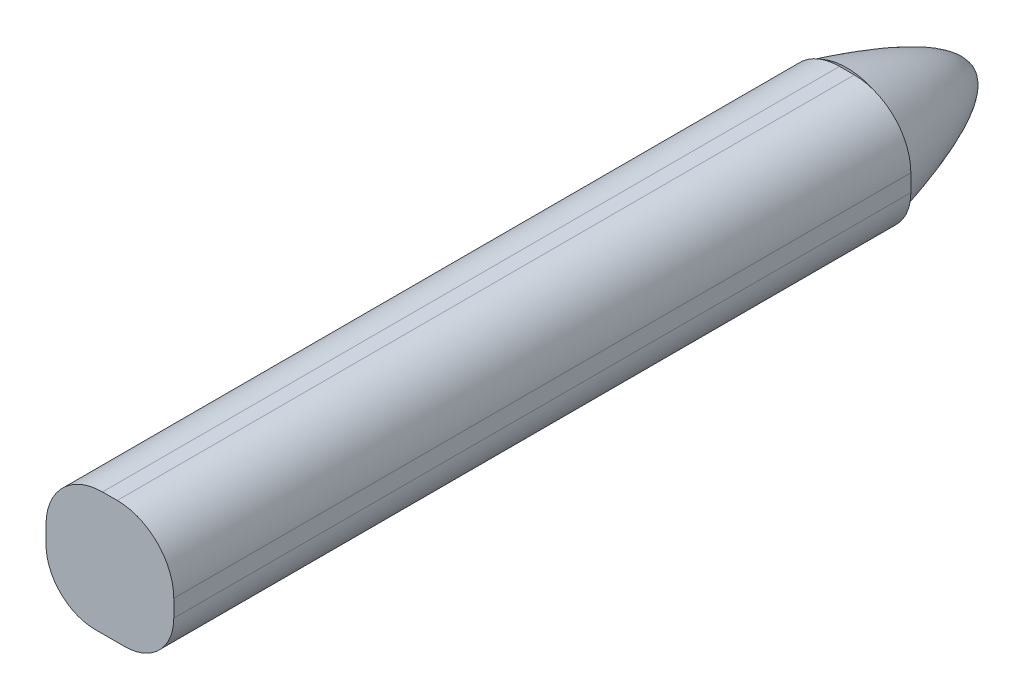
ISO-10303-21;
HEADER;
FILE_DESCRIPTION(('STEP AP214'),'2;1');
FILE_NAME('part.step','',(''),(''),'','','');
FILE_SCHEMA(('AUTOMOTIVE_DESIGN { 1 0 10303 214 1 1 1 1 }'));
ENDSEC;
DATA;
#1=APPLICATION_CONTEXT('core data for automotive mechanical design processes');
#2=APPLICATION_PROTOCOL_DEFINITION('international standard','automotive_design',2000,#1);
#3=PRODUCT_CONTEXT('',#1,'mechanical');
#4=PRODUCT('Part','Part','',(#3));
#5=PRODUCT_RELATED_PRODUCT_CATEGORY('part','',(#4));
#6=PRODUCT_DEFINITION_FORMATION('','',#4);
#7=PRODUCT_DEFINITION_CONTEXT('part definition',#1,'design');
#8=PRODUCT_DEFINITION('design','',#6,#7);
#9=PRODUCT_DEFINITION_SHAPE('','',#8);
#10=(LENGTH_UNIT() NAMED_UNIT(*) SI_UNIT(.MILLI.,.METRE.));
#11=(NAMED_UNIT(*) PLANE_ANGLE_UNIT() SI_UNIT($,.RADIAN.));
#12=(NAMED_UNIT(*) SI_UNIT($,.STERADIAN.) SOLID_ANGLE_UNIT());
#13=UNCERTAINTY_MEASURE_WITH_UNIT(LENGTH_MEASURE(1.E-05),#10,'distance_accuracy_value','');
#14=(GEOMETRIC_REPRESENTATION_CONTEXT(3) GLOBAL_UNCERTAINTY_ASSIGNED_CONTEXT((#13)) GLOBAL_UNIT_ASSIGNED_CONTEXT((#10,
#11,#12)) REPRESENTATION_CONTEXT('',''));
#15=CARTESIAN_POINT('',(0.,0.,0.));
#16=DIRECTION('',(0.,0.,1.));
#17=DIRECTION('',(1.,0.,0.));
#18=AXIS2_PLACEMENT_3D('',#15,#16,#17);
#19=CARTESIAN_POINT('',(300.,-250.,-7500.));
#20=DIRECTION('',(0.,0.,-1.));
#21=DIRECTION('',(-1.,0.,0.));
#22=AXIS2_PLACEMENT_3D('',#19,#20,#21);
#23=PLANE('',#22);
#24=CARTESIAN_POINT('',(300.,-250.,-7500.));
#25=DIRECTION('',(0.,0.,1.));
#26=DIRECTION('',(-1.,0.,0.));
#27=AXIS2_PLACEMENT_3D('',#24,#25,#26);
#28=CIRCLE('',#27,1000.);
#29=CARTESIAN_POINT('',(364.220206694953,-1247.93575196606,-7500.));
#30=VERTEX_POINT('',#29);
#31=CARTESIAN_POINT('',(1300.,-249.999999999993,-7500.));
#32=VERTEX_POINT('',#31);
#33=EDGE_CURVE('E135',#30,#32,#28,.T.);
#34=ORIENTED_EDGE('',*,*,#33,.F.);
#35=CARTESIAN_POINT('',(0.,0.,-7500.));
#36=DIRECTION('',(0.,0.,1.));
#37=DIRECTION('',(1.,0.,0.));
#38=AXIS2_PLACEMENT_3D('',#35,#36,#37);
#39=CIRCLE('',#38,1300.);
#40=CARTESIAN_POINT('',(1300.,0.,-7500.));
#41=VERTEX_POINT('',#40);
#42=EDGE_CURVE('E11',#30,#41,#39,.T.);
#43=ORIENTED_EDGE('',*,*,#42,.T.);
#44=DIRECTION('',(0.,1.,0.));
#45=VECTOR('',#44,1.);
#46=CARTESIAN_POINT('',(1300.,-249.999999999993,-7500.));
#47=LINE('',#46,#45);
#48=EDGE_CURVE('E136',#32,#41,#47,.T.);
#49=ORIENTED_EDGE('',*,*,#48,.F.);
#50=EDGE_LOOP('',(#34,#43,#49));
#51=FACE_BOUND('',#50,.T.);
#52=ADVANCED_FACE('F35',(#51),#23,.T.);
#53=CARTESIAN_POINT('',(1300.,99.9999999999919,-7500.));
#54=VERTEX_POINT('',#53);
#55=EDGE_CURVE('E134',#41,#54,#47,.T.);
#56=ORIENTED_EDGE('',*,*,#55,.F.);
#57=CARTESIAN_POINT('',(0.,0.,-7500.));
#58=DIRECTION('',(0.,0.,1.));
#59=DIRECTION('',(1.,0.,0.));
#60=AXIS2_PLACEMENT_3D('',#57,#58,#59);
#61=CIRCLE('',#60,1300.);
#62=CARTESIAN_POINT('',(547.175639296289,1179.23654105557,-7500.));
#63=VERTEX_POINT('',#62);
#64=EDGE_CURVE('E198',#41,#63,#61,.T.);
#65=ORIENTED_EDGE('',*,*,#64,.T.);
#66=CARTESIAN_POINT('',(150.,100.,-7500.));
#67=DIRECTION('',(0.,0.,1.));
#68=DIRECTION('',(-1.,0.,0.));
#69=AXIS2_PLACEMENT_3D('',#66,#67,#68);
#70=CIRCLE('',#69,1150.);
#71=EDGE_CURVE('E140',#54,#63,#70,.T.);
#72=ORIENTED_EDGE('',*,*,#71,.F.);
#73=EDGE_LOOP('',(#56,#65,#72));
#74=FACE_BOUND('',#73,.T.);
#75=ADVANCED_FACE('F245',(#74),#23,.T.);
#76=DIRECTION('',(0.,-1.,0.));
#77=VECTOR('',#76,1.);
#78=CARTESIAN_POINT('',(-1300.,-249.999999999993,-7500.));
#79=LINE('',#78,#77);
#80=CARTESIAN_POINT('',(-1300.,0.,-7500.));
#81=VERTEX_POINT('',#80);
#82=CARTESIAN_POINT('',(-1300.,-249.999999999993,-7500.));
#83=VERTEX_POINT('',#82);
#84=EDGE_CURVE('E81',#81,#83,#79,.T.);
#85=ORIENTED_EDGE('',*,*,#84,.F.);
#86=CARTESIAN_POINT('',(-364.220206694953,-1247.93575196606,-7500.));
#87=VERTEX_POINT('',#86);
#88=EDGE_CURVE('E44',#81,#87,#39,.T.);
#89=ORIENTED_EDGE('',*,*,#88,.T.);
#90=CARTESIAN_POINT('',(-300.,-250.,-7500.));
#91=DIRECTION('',(0.,0.,1.));
#92=DIRECTION('',(-1.,0.,0.));
#93=AXIS2_PLACEMENT_3D('',#90,#91,#92);
#94=CIRCLE('',#93,1000.);
#95=EDGE_CURVE('E153',#83,#87,#94,.T.);
#96=ORIENTED_EDGE('',*,*,#95,.F.);
#97=EDGE_LOOP('',(#85,#89,#96));
#98=FACE_BOUND('',#97,.T.);
#99=ADVANCED_FACE('F178',(#98),#23,.T.);
#100=CARTESIAN_POINT('',(300.,-250.,7500.));
#101=DIRECTION('',(0.,0.,-1.));
#102=DIRECTION('',(-1.,0.,0.));
#103=AXIS2_PLACEMENT_3D('',#100,#101,#102);
#104=CYLINDRICAL_SURFACE('',#103,1000.);
#105=CARTESIAN_POINT('',(299.999999999993,-1250.,-7500.));
#106=VERTEX_POINT('',#105);
#107=EDGE_CURVE('E131',#106,#30,#28,.T.);
#108=ORIENTED_EDGE('',*,*,#107,.T.);
#109=ORIENTED_EDGE('',*,*,#33,.T.);
#110=DIRECTION('',(0.,0.,-1.));
#111=VECTOR('',#110,1.);
#112=CARTESIAN_POINT('',(1300.,-249.999999999993,7500.));
#113=LINE('',#112,#111);
#114=CARTESIAN_POINT('',(1300.,-249.999999999993,7500.));
#115=VERTEX_POINT('',#114);
#116=EDGE_CURVE('E171',#115,#32,#113,.T.);
#117=ORIENTED_EDGE('',*,*,#116,.F.);
#118=CARTESIAN_POINT('',(300.,-250.,7500.));
#119=DIRECTION('',(0.,0.,1.));
#120=DIRECTION('',(-1.,0.,0.));
#121=AXIS2_PLACEMENT_3D('',#118,#119,#120);
#122=CIRCLE('',#121,1000.);
#123=CARTESIAN_POINT('',(299.999999999993,-1250.,7500.));
#124=VERTEX_POINT('',#123);
#125=EDGE_CURVE('E158',#124,#115,#122,.T.);
#126=ORIENTED_EDGE('',*,*,#125,.F.);
#127=DIRECTION('',(0.,0.,-1.));
#128=VECTOR('',#127,1.);
#129=CARTESIAN_POINT('',(299.999999999993,-1250.,7500.));
#130=LINE('',#129,#128);
#131=EDGE_CURVE('E127',#124,#106,#130,.T.);
#132=ORIENTED_EDGE('',*,*,#131,.T.);
#133=EDGE_LOOP('',(#108,#109,#117,#126,#132));
#134=FACE_BOUND('',#133,.T.);
#135=ADVANCED_FACE('F37',(#134),#104,.T.);
#136=CARTESIAN_POINT('',(1300.,-249.999999999993,7500.));
#137=DIRECTION('',(-1.,0.,0.));
#138=DIRECTION('',(0.,0.,1.));
#139=AXIS2_PLACEMENT_3D('',#136,#137,#138);
#140=PLANE('',#139);
#141=ORIENTED_EDGE('',*,*,#48,.T.);
#142=ORIENTED_EDGE('',*,*,#55,.T.);
#143=DIRECTION('',(0.,0.,-1.));
#144=VECTOR('',#143,1.);
#145=CARTESIAN_POINT('',(1300.,99.9999999999919,7500.));
#146=LINE('',#145,#144);
#147=CARTESIAN_POINT('',(1300.,99.9999999999919,7500.));
#148=VERTEX_POINT('',#147);
#149=EDGE_CURVE('E169',#148,#54,#146,.T.);
#150=ORIENTED_EDGE('',*,*,#149,.F.);
#151=DIRECTION('',(0.,1.,0.));
#152=VECTOR('',#151,1.);
#153=CARTESIAN_POINT('',(1300.,-249.999999999993,7500.));
#154=LINE('',#153,#152);
#155=EDGE_CURVE('E90',#115,#148,#154,.T.);
#156=ORIENTED_EDGE('',*,*,#155,.F.);
#157=ORIENTED_EDGE('',*,*,#116,.T.);
#158=EDGE_LOOP('',(#141,#142,#150,#156,#157));
#159=FACE_BOUND('',#158,.T.);
#160=ADVANCED_FACE('F263',(#159),#140,.F.);
#161=CARTESIAN_POINT('',(150.,100.,7500.));
#162=DIRECTION('',(0.,0.,-1.));
#163=DIRECTION('',(-1.,0.,0.));
#164=AXIS2_PLACEMENT_3D('',#161,#162,#163);
#165=CYLINDRICAL_SURFACE('',#164,1150.);
#166=ORIENTED_EDGE('',*,*,#71,.T.);
#167=CARTESIAN_POINT('',(149.999999999992,1250.,-7500.));
#168=VERTEX_POINT('',#167);
#169=EDGE_CURVE('E139',#63,#168,#70,.T.);
#170=ORIENTED_EDGE('',*,*,#169,.T.);
#171=DIRECTION('',(0.,0.,-1.));
#172=VECTOR('',#171,1.);
#173=CARTESIAN_POINT('',(149.999999999992,1250.,7500.));
#174=LINE('',#173,#172);
#175=CARTESIAN_POINT('',(149.999999999992,1250.,7500.));
#176=VERTEX_POINT('',#175);
#177=EDGE_CURVE('E166',#176,#168,#174,.T.);
#178=ORIENTED_EDGE('',*,*,#177,.F.);
#179=CARTESIAN_POINT('',(150.,100.,7500.));
#180=DIRECTION('',(0.,0.,1.));
#181=DIRECTION('',(-1.,0.,0.));
#182=AXIS2_PLACEMENT_3D('',#179,#180,#181);
#183=CIRCLE('',#182,1150.);
#184=EDGE_CURVE('E195',#148,#176,#183,.T.);
#185=ORIENTED_EDGE('',*,*,#184,.F.);
#186=ORIENTED_EDGE('',*,*,#149,.T.);
#187=EDGE_LOOP('',(#166,#170,#178,#185,#186));
#188=FACE_BOUND('',#187,.T.);
#189=ADVANCED_FACE('F267',(#188),#165,.T.);
#190=CARTESIAN_POINT('',(-149.999999999992,1250.,7500.));
#191=DIRECTION('',(0.,-1.,0.));
#192=DIRECTION('',(0.,0.,-1.));
#193=AXIS2_PLACEMENT_3D('',#190,#191,#192);
#194=PLANE('',#193);
#195=DIRECTION('',(-1.,0.,0.));
#196=VECTOR('',#195,1.);
#197=CARTESIAN_POINT('',(-149.999999999992,1250.,-7500.));
#198=LINE('',#197,#196);
#199=CARTESIAN_POINT('',(-149.999999999992,1250.,-7500.));
#200=VERTEX_POINT('',#199);
#201=EDGE_CURVE('E143',#168,#200,#198,.T.);
#202=ORIENTED_EDGE('',*,*,#201,.T.);
#203=DIRECTION('',(0.,0.,-1.));
#204=VECTOR('',#203,1.);
#205=CARTESIAN_POINT('',(-149.999999999992,1250.,7500.));
#206=LINE('',#205,#204);
#207=CARTESIAN_POINT('',(-149.999999999992,1250.,7500.));
#208=VERTEX_POINT('',#207);
#209=EDGE_CURVE('E163',#208,#200,#206,.T.);
#210=ORIENTED_EDGE('',*,*,#209,.F.);
#211=DIRECTION('',(-1.,0.,0.));
#212=VECTOR('',#211,1.);
#213=CARTESIAN_POINT('',(-149.999999999992,1250.,7500.));
#214=LINE('',#213,#212);
#215=EDGE_CURVE('E202',#176,#208,#214,.T.);
#216=ORIENTED_EDGE('',*,*,#215,.F.);
#217=ORIENTED_EDGE('',*,*,#177,.T.);
#218=EDGE_LOOP('',(#202,#210,#216,#217));
#219=FACE_BOUND('',#218,.T.);
#220=ADVANCED_FACE('F208',(#219),#194,.F.);
#221=CARTESIAN_POINT('',(-150.,100.,7500.));
#222=DIRECTION('',(0.,0.,-1.));
#223=DIRECTION('',(-1.,0.,0.));
#224=AXIS2_PLACEMENT_3D('',#221,#222,#223);
#225=CYLINDRICAL_SURFACE('',#224,1150.);
#226=CARTESIAN_POINT('',(-150.,100.,-7500.));
#227=DIRECTION('',(0.,0.,1.));
#228=DIRECTION('',(1.,0.,0.));
#229=AXIS2_PLACEMENT_3D('',#226,#227,#228);
#230=CIRCLE('',#229,1150.);
#231=CARTESIAN_POINT('',(-547.175639296289,1179.23654105557,-7500.));
#232=VERTEX_POINT('',#231);
#233=EDGE_CURVE('E147',#200,#232,#230,.T.);
#234=ORIENTED_EDGE('',*,*,#233,.T.);
#235=CARTESIAN_POINT('',(-1300.,99.9999999999921,-7500.));
#236=VERTEX_POINT('',#235);
#237=EDGE_CURVE('E146',#232,#236,#230,.T.);
#238=ORIENTED_EDGE('',*,*,#237,.T.);
#239=DIRECTION('',(0.,0.,-1.));
#240=VECTOR('',#239,1.);
#241=CARTESIAN_POINT('',(-1300.,99.9999999999921,7500.));
#242=LINE('',#241,#240);
#243=CARTESIAN_POINT('',(-1300.,99.9999999999921,7500.));
#244=VERTEX_POINT('',#243);
#245=EDGE_CURVE('E120',#244,#236,#242,.T.);
#246=ORIENTED_EDGE('',*,*,#245,.F.);
#247=CARTESIAN_POINT('',(-150.,100.,7500.));
#248=DIRECTION('',(0.,0.,1.));
#249=DIRECTION('',(1.,0.,0.));
#250=AXIS2_PLACEMENT_3D('',#247,#248,#249);
#251=CIRCLE('',#250,1150.);
#252=EDGE_CURVE('E111',#208,#244,#251,.T.);
#253=ORIENTED_EDGE('',*,*,#252,.F.);
#254=ORIENTED_EDGE('',*,*,#209,.T.);
#255=EDGE_LOOP('',(#234,#238,#246,#253,#254));
#256=FACE_BOUND('',#255,.T.);
#257=ADVANCED_FACE('F211',(#256),#225,.T.);
#258=CARTESIAN_POINT('',(-1300.,-249.999999999993,7500.));
#259=DIRECTION('',(1.,0.,0.));
#260=DIRECTION('',(0.,0.,-1.));
#261=AXIS2_PLACEMENT_3D('',#258,#259,#260);
#262=PLANE('',#261);
#263=EDGE_CURVE('E150',#236,#81,#79,.T.);
#264=ORIENTED_EDGE('',*,*,#263,.T.);
#265=ORIENTED_EDGE('',*,*,#84,.T.);
#266=DIRECTION('',(0.,0.,-1.));
#267=VECTOR('',#266,1.);
#268=CARTESIAN_POINT('',(-1300.,-249.999999999993,7500.));
#269=LINE('',#268,#267);
#270=CARTESIAN_POINT('',(-1300.,-249.999999999993,7500.));
#271=VERTEX_POINT('',#270);
#272=EDGE_CURVE('E115',#271,#83,#269,.T.);
#273=ORIENTED_EDGE('',*,*,#272,.F.);
#274=DIRECTION('',(0.,-1.,0.));
#275=VECTOR('',#274,1.);
#276=CARTESIAN_POINT('',(-1300.,-249.999999999993,7500.));
#277=LINE('',#276,#275);
#278=EDGE_CURVE('E105',#244,#271,#277,.T.);
#279=ORIENTED_EDGE('',*,*,#278,.F.);
#280=ORIENTED_EDGE('',*,*,#245,.T.);
#281=EDGE_LOOP('',(#264,#265,#273,#279,#280));
#282=FACE_BOUND('',#281,.T.);
#283=ADVANCED_FACE('F116',(#282),#262,.F.);
#284=CARTESIAN_POINT('',(-300.,-250.,7500.));
#285=DIRECTION('',(0.,0.,-1.));
#286=DIRECTION('',(-1.,0.,0.));
#287=AXIS2_PLACEMENT_3D('',#284,#285,#286);
#288=CYLINDRICAL_SURFACE('',#287,1000.);
#289=ORIENTED_EDGE('',*,*,#95,.T.);
#290=CARTESIAN_POINT('',(-299.999999999993,-1250.,-7500.));
#291=VERTEX_POINT('',#290);
#292=EDGE_CURVE('E152',#87,#291,#94,.T.);
#293=ORIENTED_EDGE('',*,*,#292,.T.);
#294=DIRECTION('',(0.,0.,-1.));
#295=VECTOR('',#294,1.);
#296=CARTESIAN_POINT('',(-299.999999999993,-1250.,7500.));
#297=LINE('',#296,#295);
#298=CARTESIAN_POINT('',(-299.999999999993,-1250.,7500.));
#299=VERTEX_POINT('',#298);
#300=EDGE_CURVE('E121',#299,#291,#297,.T.);
#301=ORIENTED_EDGE('',*,*,#300,.F.);
#302=CARTESIAN_POINT('',(-300.,-250.,7500.));
#303=DIRECTION('',(0.,0.,1.));
#304=DIRECTION('',(-1.,0.,0.));
#305=AXIS2_PLACEMENT_3D('',#302,#303,#304);
#306=CIRCLE('',#305,1000.);
#307=EDGE_CURVE('E108',#271,#299,#306,.T.);
#308=ORIENTED_EDGE('',*,*,#307,.F.);
#309=ORIENTED_EDGE('',*,*,#272,.T.);
#310=EDGE_LOOP('',(#289,#293,#301,#308,#309));
#311=FACE_BOUND('',#310,.T.);
#312=ADVANCED_FACE('F123',(#311),#288,.T.);
#313=CARTESIAN_POINT('',(-299.999999999993,-1250.,7500.));
#314=DIRECTION('',(0.,1.,0.));
#315=DIRECTION('',(0.,0.,1.));
#316=AXIS2_PLACEMENT_3D('',#313,#314,#315);
#317=PLANE('',#316);
#318=DIRECTION('',(1.,0.,0.));
#319=VECTOR('',#318,1.);
#320=CARTESIAN_POINT('',(-299.999999999993,-1250.,-7500.));
#321=LINE('',#320,#319);
#322=EDGE_CURVE('E155',#291,#106,#321,.T.);
#323=ORIENTED_EDGE('',*,*,#322,.T.);
#324=ORIENTED_EDGE('',*,*,#131,.F.);
#325=DIRECTION('',(1.,0.,0.));
#326=VECTOR('',#325,1.);
#327=CARTESIAN_POINT('',(-299.999999999993,-1250.,7500.));
#328=LINE('',#327,#326);
#329=EDGE_CURVE('E59',#299,#124,#328,.T.);
#330=ORIENTED_EDGE('',*,*,#329,.F.);
#331=ORIENTED_EDGE('',*,*,#300,.T.);
#332=EDGE_LOOP('',(#323,#324,#330,#331));
#333=FACE_BOUND('',#332,.T.);
#334=ADVANCED_FACE('F191',(#333),#317,.F.);
#335=CARTESIAN_POINT('',(300.,-250.,7500.));
#336=DIRECTION('',(0.,0.,-1.));
#337=DIRECTION('',(-1.,0.,0.));
#338=AXIS2_PLACEMENT_3D('',#335,#336,#337);
#339=PLANE('',#338);
#340=ORIENTED_EDGE('',*,*,#125,.T.);
#341=ORIENTED_EDGE('',*,*,#155,.T.);
#342=ORIENTED_EDGE('',*,*,#184,.T.);
#343=ORIENTED_EDGE('',*,*,#215,.T.);
#344=ORIENTED_EDGE('',*,*,#252,.T.);
#345=ORIENTED_EDGE('',*,*,#278,.T.);
#346=ORIENTED_EDGE('',*,*,#307,.T.);
#347=ORIENTED_EDGE('',*,*,#329,.T.);
#348=EDGE_LOOP('',(#340,#341,#342,#343,#344,#345,#346,#347));
#349=FACE_BOUND('',#348,.T.);
#350=ADVANCED_FACE('F106',(#349),#339,.F.);
#351=ORIENTED_EDGE('',*,*,#237,.F.);
#352=EDGE_CURVE('E39',#232,#81,#39,.T.);
#353=ORIENTED_EDGE('',*,*,#352,.T.);
#354=ORIENTED_EDGE('',*,*,#263,.F.);
#355=EDGE_LOOP('',(#351,#353,#354));
#356=FACE_BOUND('',#355,.T.);
#357=ADVANCED_FACE('F212',(#356),#23,.T.);
#358=CARTESIAN_POINT('',(0.,0.,-7500.));
#359=DIRECTION('',(0.,0.,-1.));
#360=DIRECTION('',(-1.,0.,0.));
#361=AXIS2_PLACEMENT_3D('',#358,#359,#360);
#362=PLANE('',#361);
#363=ORIENTED_EDGE('',*,*,#201,.F.);
#364=ORIENTED_EDGE('',*,*,#169,.F.);
#365=EDGE_CURVE('E222',#63,#232,#61,.T.);
#366=ORIENTED_EDGE('',*,*,#365,.T.);
#367=ORIENTED_EDGE('',*,*,#233,.F.);
#368=EDGE_LOOP('',(#363,#364,#366,#367));
#369=FACE_BOUND('',#368,.T.);
#370=ADVANCED_FACE('F218',(#369),#362,.F.);
#371=EDGE_CURVE('E370',#87,#30,#61,.T.);
#372=ORIENTED_EDGE('',*,*,#371,.T.);
#373=ORIENTED_EDGE('',*,*,#107,.F.);
#374=ORIENTED_EDGE('',*,*,#322,.F.);
#375=ORIENTED_EDGE('',*,*,#292,.F.);
#376=EDGE_LOOP('',(#372,#373,#374,#375));
#377=FACE_BOUND('',#376,.T.);
#378=ADVANCED_FACE('F237',(#377),#362,.F.);
#379=CARTESIAN_POINT('',(0.,0.,-10000.));
#380=CARTESIAN_POINT('',(-650.,0.,-10000.));
#381=CARTESIAN_POINT('',(-1300.,0.,-7500.));
#382=B_SPLINE_CURVE_WITH_KNOTS('',2,(#379,#380,#381),.UNSPECIFIED.,.F.,.F.,(3,3),(0.,0.5),.UNSPECIFIED.);
#383=CARTESIAN_POINT('',(0.,0.,-7500.));
#384=DIRECTION('',(0.,0.,1.));
#385=AXIS1_PLACEMENT('',#383,#384);
#386=SURFACE_OF_REVOLUTION('',#382,#385);
#387=ORIENTED_EDGE('',*,*,#64,.F.);
#388=ORIENTED_EDGE('',*,*,#42,.F.);
#389=ORIENTED_EDGE('',*,*,#371,.F.);
#390=ORIENTED_EDGE('',*,*,#88,.F.);
#391=ORIENTED_EDGE('',*,*,#352,.F.);
#392=ORIENTED_EDGE('',*,*,#365,.F.);
#393=EDGE_LOOP('',(#387,#388,#389,#390,#391,#392));
#394=FACE_BOUND('',#393,.T.);
#395=CARTESIAN_POINT('',(0.,0.,-10000.));
#396=VERTEX_POINT('',#395);
#397=VERTEX_LOOP('',#396);
#398=FACE_BOUND('',#397,.T.);
#399=ADVANCED_FACE('F235',(#394,#398),#386,.T.);
#400=CLOSED_SHELL('',(#52,#75,#99,#135,#160,#189,#220,#257,#283,#312,#334,#350,#357,#370,#378,#399));
#401=MANIFOLD_SOLID_BREP('B2',#400);
#402=ADVANCED_BREP_SHAPE_REPRESENTATION('',(#18,#401),#14);
#403=SHAPE_DEFINITION_REPRESENTATION(#9,#402);
ENDSEC;
END-ISO-10303-21;
